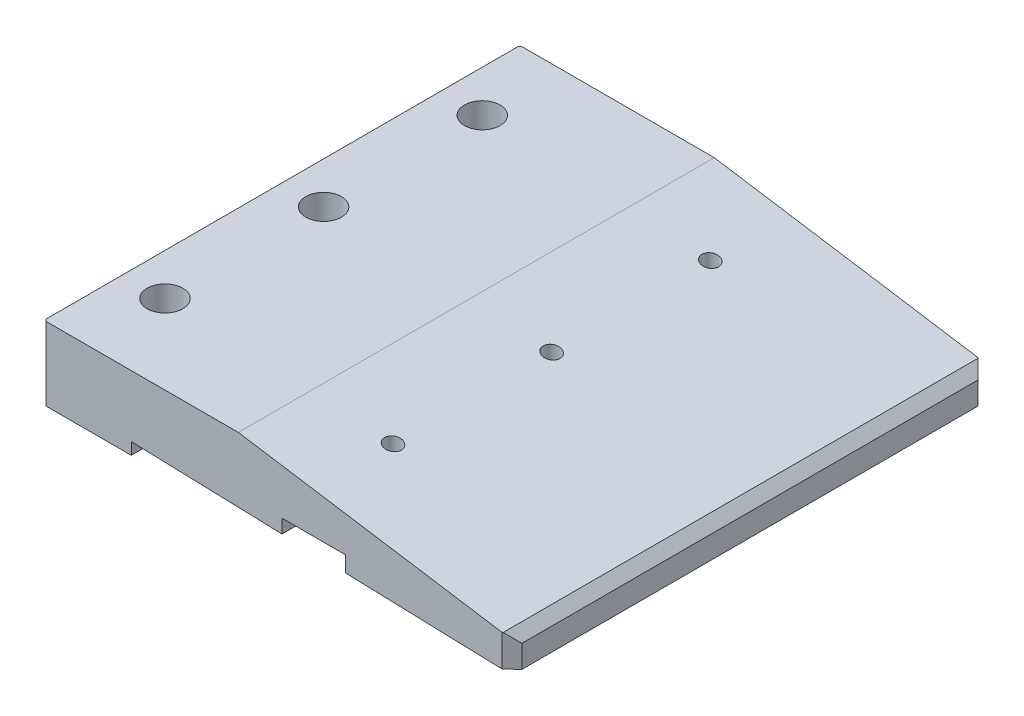
ISO-10303-21;
HEADER;
FILE_DESCRIPTION(('STEP AP214'),'2;1');
FILE_NAME('part.step','',(''),(''),'','','');
FILE_SCHEMA(('AUTOMOTIVE_DESIGN { 1 0 10303 214 1 1 1 1 }'));
ENDSEC;
DATA;
#1=APPLICATION_CONTEXT('core data for automotive mechanical design processes');
#2=APPLICATION_PROTOCOL_DEFINITION('international standard','automotive_design',2000,#1);
#3=PRODUCT_CONTEXT('',#1,'mechanical');
#4=PRODUCT('Part','Part','',(#3));
#5=PRODUCT_RELATED_PRODUCT_CATEGORY('part','',(#4));
#6=PRODUCT_DEFINITION_FORMATION('','',#4);
#7=PRODUCT_DEFINITION_CONTEXT('part definition',#1,'design');
#8=PRODUCT_DEFINITION('design','',#6,#7);
#9=PRODUCT_DEFINITION_SHAPE('','',#8);
#10=(LENGTH_UNIT() NAMED_UNIT(*) SI_UNIT(.MILLI.,.METRE.));
#11=(NAMED_UNIT(*) PLANE_ANGLE_UNIT() SI_UNIT($,.RADIAN.));
#12=(NAMED_UNIT(*) SI_UNIT($,.STERADIAN.) SOLID_ANGLE_UNIT());
#13=UNCERTAINTY_MEASURE_WITH_UNIT(LENGTH_MEASURE(1.E-05),#10,'distance_accuracy_value','');
#14=(GEOMETRIC_REPRESENTATION_CONTEXT(3) GLOBAL_UNCERTAINTY_ASSIGNED_CONTEXT((#13)) GLOBAL_UNIT_ASSIGNED_CONTEXT((#10,
#11,#12)) REPRESENTATION_CONTEXT('',''));
#15=CARTESIAN_POINT('',(0.,0.,0.));
#16=DIRECTION('',(0.,0.,1.));
#17=DIRECTION('',(1.,0.,0.));
#18=AXIS2_PLACEMENT_3D('',#15,#16,#17);
#19=CARTESIAN_POINT('',(0.,-18.5,120.));
#20=DIRECTION('',(1.,0.,0.));
#21=DIRECTION('',(0.,0.,-1.));
#22=AXIS2_PLACEMENT_3D('',#19,#20,#21);
#23=PLANE('',#22);
#24=DIRECTION('',(0.,1.,0.));
#25=VECTOR('',#24,1.);
#26=CARTESIAN_POINT('',(0.,-18.5,117.5));
#27=LINE('',#26,#25);
#28=CARTESIAN_POINT('',(0.,-18.5,117.5));
#29=VERTEX_POINT('',#28);
#30=CARTESIAN_POINT('',(0.,-2.,117.5));
#31=VERTEX_POINT('',#30);
#32=EDGE_CURVE('E234',#29,#31,#27,.T.);
#33=ORIENTED_EDGE('',*,*,#32,.T.);
#34=DIRECTION('',(0.,0.,-1.));
#35=VECTOR('',#34,1.);
#36=CARTESIAN_POINT('',(0.,-2.,120.));
#37=LINE('',#36,#35);
#38=CARTESIAN_POINT('',(0.,-2.,2.5));
#39=VERTEX_POINT('',#38);
#40=EDGE_CURVE('E278',#31,#39,#37,.T.);
#41=ORIENTED_EDGE('',*,*,#40,.T.);
#42=DIRECTION('',(0.,-1.,0.));
#43=VECTOR('',#42,1.);
#44=CARTESIAN_POINT('',(0.,-18.5,2.5));
#45=LINE('',#44,#43);
#46=CARTESIAN_POINT('',(0.,-18.5,2.5));
#47=VERTEX_POINT('',#46);
#48=EDGE_CURVE('E237',#39,#47,#45,.T.);
#49=ORIENTED_EDGE('',*,*,#48,.T.);
#50=DIRECTION('',(0.,0.,-1.));
#51=VECTOR('',#50,1.);
#52=CARTESIAN_POINT('',(0.,-18.5,120.));
#53=LINE('',#52,#51);
#54=EDGE_CURVE('E172',#29,#47,#53,.T.);
#55=ORIENTED_EDGE('',*,*,#54,.F.);
#56=EDGE_LOOP('',(#33,#41,#49,#55));
#57=FACE_BOUND('',#56,.T.);
#58=ADVANCED_FACE('F33',(#57),#23,.F.);
#59=CARTESIAN_POINT('',(24.,-18.5,120.));
#60=DIRECTION('',(0.,1.,0.));
#61=DIRECTION('',(-1.,0.,0.));
#62=AXIS2_PLACEMENT_3D('',#59,#60,#61);
#63=PLANE('',#62);
#64=CARTESIAN_POINT('',(12.5,-18.5,20.));
#65=DIRECTION('',(0.,-1.,0.));
#66=DIRECTION('',(0.,0.,-1.));
#67=AXIS2_PLACEMENT_3D('',#64,#65,#66);
#68=CIRCLE('',#67,7.50000000000001);
#69=CARTESIAN_POINT('',(12.5,-18.5,12.5));
#70=VERTEX_POINT('',#69);
#71=EDGE_CURVE('E646',#70,#70,#68,.T.);
#72=ORIENTED_EDGE('',*,*,#71,.F.);
#73=EDGE_LOOP('',(#72));
#74=FACE_BOUND('',#73,.T.);
#75=CARTESIAN_POINT('',(12.5,-18.5,60.));
#76=DIRECTION('',(0.,-1.,0.));
#77=DIRECTION('',(0.,0.,-1.));
#78=AXIS2_PLACEMENT_3D('',#75,#76,#77);
#79=CIRCLE('',#78,7.50000000000001);
#80=CARTESIAN_POINT('',(12.5,-18.5,52.5));
#81=VERTEX_POINT('',#80);
#82=EDGE_CURVE('E634',#81,#81,#79,.T.);
#83=ORIENTED_EDGE('',*,*,#82,.F.);
#84=EDGE_LOOP('',(#83));
#85=FACE_BOUND('',#84,.T.);
#86=CARTESIAN_POINT('',(12.5,-18.5,100.));
#87=DIRECTION('',(0.,-1.,0.));
#88=DIRECTION('',(0.,0.,-1.));
#89=AXIS2_PLACEMENT_3D('',#86,#87,#88);
#90=CIRCLE('',#89,7.50000000000001);
#91=CARTESIAN_POINT('',(12.5,-18.5,92.5));
#92=VERTEX_POINT('',#91);
#93=EDGE_CURVE('E620',#92,#92,#90,.T.);
#94=ORIENTED_EDGE('',*,*,#93,.F.);
#95=EDGE_LOOP('',(#94));
#96=FACE_BOUND('',#95,.T.);
#97=ORIENTED_EDGE('',*,*,#54,.T.);
#98=DIRECTION('',(0.707106781186548,0.,-0.707106781186548));
#99=VECTOR('',#98,1.);
#100=CARTESIAN_POINT('',(0.,-18.5,2.5));
#101=LINE('',#100,#99);
#102=CARTESIAN_POINT('',(2.5,-18.5,0.));
#103=VERTEX_POINT('',#102);
#104=EDGE_CURVE('E241',#47,#103,#101,.T.);
#105=ORIENTED_EDGE('',*,*,#104,.T.);
#106=DIRECTION('',(1.,0.,0.));
#107=VECTOR('',#106,1.);
#108=CARTESIAN_POINT('',(24.,-18.5,0.));
#109=LINE('',#108,#107);
#110=CARTESIAN_POINT('',(24.,-18.5,0.));
#111=VERTEX_POINT('',#110);
#112=EDGE_CURVE('E169',#103,#111,#109,.T.);
#113=ORIENTED_EDGE('',*,*,#112,.T.);
#114=DIRECTION('',(0.,0.,-1.));
#115=VECTOR('',#114,1.);
#116=CARTESIAN_POINT('',(24.,-18.5,120.));
#117=LINE('',#116,#115);
#118=CARTESIAN_POINT('',(24.,-18.5,120.));
#119=VERTEX_POINT('',#118);
#120=EDGE_CURVE('E165',#119,#111,#117,.T.);
#121=ORIENTED_EDGE('',*,*,#120,.F.);
#122=DIRECTION('',(1.,0.,0.));
#123=VECTOR('',#122,1.);
#124=CARTESIAN_POINT('',(24.,-18.5,120.));
#125=LINE('',#124,#123);
#126=CARTESIAN_POINT('',(2.5,-18.5,120.));
#127=VERTEX_POINT('',#126);
#128=EDGE_CURVE('E151',#127,#119,#125,.T.);
#129=ORIENTED_EDGE('',*,*,#128,.F.);
#130=DIRECTION('',(0.707106781186546,0.,0.707106781186549));
#131=VECTOR('',#130,1.);
#132=CARTESIAN_POINT('',(2.5,-18.5,120.));
#133=LINE('',#132,#131);
#134=EDGE_CURVE('E239',#127,#29,#133,.F.);
#135=ORIENTED_EDGE('',*,*,#134,.T.);
#136=EDGE_LOOP('',(#97,#105,#113,#121,#129,#135));
#137=FACE_BOUND('',#136,.T.);
#138=ADVANCED_FACE('F167',(#74,#85,#96,#137),#63,.F.);
#139=CARTESIAN_POINT('',(24.,-15.5,120.));
#140=DIRECTION('',(-1.,0.,0.));
#141=DIRECTION('',(0.,0.,1.));
#142=AXIS2_PLACEMENT_3D('',#139,#140,#141);
#143=PLANE('',#142);
#144=DIRECTION('',(0.,1.,0.));
#145=VECTOR('',#144,1.);
#146=CARTESIAN_POINT('',(24.,-15.5,0.));
#147=LINE('',#146,#145);
#148=CARTESIAN_POINT('',(24.,-15.5,0.));
#149=VERTEX_POINT('',#148);
#150=EDGE_CURVE('E197',#111,#149,#147,.T.);
#151=ORIENTED_EDGE('',*,*,#150,.T.);
#152=DIRECTION('',(0.,0.,-1.));
#153=VECTOR('',#152,1.);
#154=CARTESIAN_POINT('',(24.,-15.5,120.));
#155=LINE('',#154,#153);
#156=CARTESIAN_POINT('',(24.,-15.5,120.));
#157=VERTEX_POINT('',#156);
#158=EDGE_CURVE('E173',#157,#149,#155,.T.);
#159=ORIENTED_EDGE('',*,*,#158,.F.);
#160=DIRECTION('',(0.,1.,0.));
#161=VECTOR('',#160,1.);
#162=CARTESIAN_POINT('',(24.,-15.5,120.));
#163=LINE('',#162,#161);
#164=EDGE_CURVE('E156',#119,#157,#163,.T.);
#165=ORIENTED_EDGE('',*,*,#164,.F.);
#166=ORIENTED_EDGE('',*,*,#120,.T.);
#167=EDGE_LOOP('',(#151,#159,#165,#166));
#168=FACE_BOUND('',#167,.T.);
#169=ADVANCED_FACE('F175',(#168),#143,.F.);
#170=CARTESIAN_POINT('',(62.,-16.6875,120.));
#171=DIRECTION('',(0.0312347523777212,0.999512076087079,0.));
#172=DIRECTION('',(-0.999512076087079,0.0312347523777212,0.));
#173=AXIS2_PLACEMENT_3D('',#170,#171,#172);
#174=PLANE('',#173);
#175=DIRECTION('',(0.999512076087079,-0.0312347523777212,0.));
#176=VECTOR('',#175,1.);
#177=CARTESIAN_POINT('',(62.,-16.6875,0.));
#178=LINE('',#177,#176);
#179=CARTESIAN_POINT('',(62.,-16.6875,0.));
#180=VERTEX_POINT('',#179);
#181=EDGE_CURVE('E200',#149,#180,#178,.T.);
#182=ORIENTED_EDGE('',*,*,#181,.T.);
#183=DIRECTION('',(0.,0.,-1.));
#184=VECTOR('',#183,1.);
#185=CARTESIAN_POINT('',(62.,-16.6875,120.));
#186=LINE('',#185,#184);
#187=CARTESIAN_POINT('',(62.,-16.6875,120.));
#188=VERTEX_POINT('',#187);
#189=EDGE_CURVE('E229',#188,#180,#186,.T.);
#190=ORIENTED_EDGE('',*,*,#189,.F.);
#191=DIRECTION('',(0.999512076087079,-0.0312347523777212,0.));
#192=VECTOR('',#191,1.);
#193=CARTESIAN_POINT('',(62.,-16.6875,120.));
#194=LINE('',#193,#192);
#195=EDGE_CURVE('E178',#157,#188,#194,.T.);
#196=ORIENTED_EDGE('',*,*,#195,.F.);
#197=ORIENTED_EDGE('',*,*,#158,.T.);
#198=EDGE_LOOP('',(#182,#190,#196,#197));
#199=FACE_BOUND('',#198,.T.);
#200=ADVANCED_FACE('F561',(#199),#174,.F.);
#201=CARTESIAN_POINT('',(62.,-13.2175,120.));
#202=DIRECTION('',(-1.,0.,0.));
#203=DIRECTION('',(0.,0.,1.));
#204=AXIS2_PLACEMENT_3D('',#201,#202,#203);
#205=PLANE('',#204);
#206=DIRECTION('',(0.,1.,0.));
#207=VECTOR('',#206,1.);
#208=CARTESIAN_POINT('',(62.,-13.2175,0.));
#209=LINE('',#208,#207);
#210=CARTESIAN_POINT('',(62.,-13.2175,0.));
#211=VERTEX_POINT('',#210);
#212=EDGE_CURVE('E202',#180,#211,#209,.T.);
#213=ORIENTED_EDGE('',*,*,#212,.T.);
#214=DIRECTION('',(0.,0.,-1.));
#215=VECTOR('',#214,1.);
#216=CARTESIAN_POINT('',(62.,-13.2175,120.));
#217=LINE('',#216,#215);
#218=CARTESIAN_POINT('',(62.,-13.2175,120.));
#219=VERTEX_POINT('',#218);
#220=EDGE_CURVE('E226',#219,#211,#217,.T.);
#221=ORIENTED_EDGE('',*,*,#220,.F.);
#222=DIRECTION('',(0.,1.,0.));
#223=VECTOR('',#222,1.);
#224=CARTESIAN_POINT('',(62.,-13.2175,120.));
#225=LINE('',#224,#223);
#226=EDGE_CURVE('E180',#188,#219,#225,.T.);
#227=ORIENTED_EDGE('',*,*,#226,.F.);
#228=ORIENTED_EDGE('',*,*,#189,.T.);
#229=EDGE_LOOP('',(#213,#221,#227,#228));
#230=FACE_BOUND('',#229,.T.);
#231=ADVANCED_FACE('F460',(#230),#205,.F.);
#232=CARTESIAN_POINT('',(78.,-13.2175,120.));
#233=DIRECTION('',(0.,1.,0.));
#234=DIRECTION('',(-1.,0.,0.));
#235=AXIS2_PLACEMENT_3D('',#232,#233,#234);
#236=PLANE('',#235);
#237=CARTESIAN_POINT('',(70.,-13.2175,100.));
#238=DIRECTION('',(0.,-1.,0.));
#239=DIRECTION('',(1.,0.,0.));
#240=AXIS2_PLACEMENT_3D('',#237,#238,#239);
#241=CIRCLE('',#240,2.1);
#242=CARTESIAN_POINT('',(72.1,-13.2175,100.));
#243=VERTEX_POINT('',#242);
#244=EDGE_CURVE('E660',#243,#243,#241,.T.);
#245=ORIENTED_EDGE('',*,*,#244,.F.);
#246=EDGE_LOOP('',(#245));
#247=FACE_BOUND('',#246,.T.);
#248=CARTESIAN_POINT('',(70.,-13.2175,60.));
#249=DIRECTION('',(0.,-1.,0.));
#250=DIRECTION('',(1.,0.,0.));
#251=AXIS2_PLACEMENT_3D('',#248,#249,#250);
#252=CIRCLE('',#251,2.1);
#253=CARTESIAN_POINT('',(72.1,-13.2175,60.));
#254=VERTEX_POINT('',#253);
#255=EDGE_CURVE('E653',#254,#254,#252,.T.);
#256=ORIENTED_EDGE('',*,*,#255,.F.);
#257=EDGE_LOOP('',(#256));
#258=FACE_BOUND('',#257,.T.);
#259=CARTESIAN_POINT('',(70.,-13.2175,20.));
#260=DIRECTION('',(0.,-1.,0.));
#261=DIRECTION('',(1.,0.,0.));
#262=AXIS2_PLACEMENT_3D('',#259,#260,#261);
#263=CIRCLE('',#262,2.1);
#264=CARTESIAN_POINT('',(72.1,-13.2175,20.));
#265=VERTEX_POINT('',#264);
#266=EDGE_CURVE('E654',#265,#265,#263,.T.);
#267=ORIENTED_EDGE('',*,*,#266,.F.);
#268=EDGE_LOOP('',(#267));
#269=FACE_BOUND('',#268,.T.);
#270=DIRECTION('',(1.,0.,0.));
#271=VECTOR('',#270,1.);
#272=CARTESIAN_POINT('',(78.,-13.2175,0.));
#273=LINE('',#272,#271);
#274=CARTESIAN_POINT('',(78.,-13.2175,0.));
#275=VERTEX_POINT('',#274);
#276=EDGE_CURVE('E204',#211,#275,#273,.T.);
#277=ORIENTED_EDGE('',*,*,#276,.T.);
#278=DIRECTION('',(0.,0.,-1.));
#279=VECTOR('',#278,1.);
#280=CARTESIAN_POINT('',(78.,-13.2175,120.));
#281=LINE('',#280,#279);
#282=CARTESIAN_POINT('',(78.,-13.2175,120.));
#283=VERTEX_POINT('',#282);
#284=EDGE_CURVE('E223',#283,#275,#281,.T.);
#285=ORIENTED_EDGE('',*,*,#284,.F.);
#286=DIRECTION('',(1.,0.,0.));
#287=VECTOR('',#286,1.);
#288=CARTESIAN_POINT('',(78.,-13.2175,120.));
#289=LINE('',#288,#287);
#290=EDGE_CURVE('E185',#219,#283,#289,.T.);
#291=ORIENTED_EDGE('',*,*,#290,.F.);
#292=ORIENTED_EDGE('',*,*,#220,.T.);
#293=EDGE_LOOP('',(#277,#285,#291,#292));
#294=FACE_BOUND('',#293,.T.);
#295=ADVANCED_FACE('F455',(#247,#258,#269,#294),#236,.F.);
#296=CARTESIAN_POINT('',(78.,-17.1875,120.));
#297=DIRECTION('',(1.,0.,0.));
#298=DIRECTION('',(0.,1.,0.));
#299=AXIS2_PLACEMENT_3D('',#296,#297,#298);
#300=PLANE('',#299);
#301=DIRECTION('',(0.,-1.,0.));
#302=VECTOR('',#301,1.);
#303=CARTESIAN_POINT('',(78.,-17.1875,0.));
#304=LINE('',#303,#302);
#305=CARTESIAN_POINT('',(78.,-17.1875,0.));
#306=VERTEX_POINT('',#305);
#307=EDGE_CURVE('E206',#275,#306,#304,.T.);
#308=ORIENTED_EDGE('',*,*,#307,.T.);
#309=DIRECTION('',(0.,0.,-1.));
#310=VECTOR('',#309,1.);
#311=CARTESIAN_POINT('',(78.,-17.1875,120.));
#312=LINE('',#311,#310);
#313=CARTESIAN_POINT('',(78.,-17.1875,120.));
#314=VERTEX_POINT('',#313);
#315=EDGE_CURVE('E220',#314,#306,#312,.T.);
#316=ORIENTED_EDGE('',*,*,#315,.F.);
#317=DIRECTION('',(0.,-1.,0.));
#318=VECTOR('',#317,1.);
#319=CARTESIAN_POINT('',(78.,-17.1875,120.));
#320=LINE('',#319,#318);
#321=EDGE_CURVE('E187',#283,#314,#320,.T.);
#322=ORIENTED_EDGE('',*,*,#321,.F.);
#323=ORIENTED_EDGE('',*,*,#284,.T.);
#324=EDGE_LOOP('',(#308,#316,#322,#323));
#325=FACE_BOUND('',#324,.T.);
#326=ADVANCED_FACE('F413',(#325),#300,.F.);
#327=CARTESIAN_POINT('',(120.,-18.5,120.));
#328=DIRECTION('',(0.0312347523777211,0.999512076087079,0.));
#329=DIRECTION('',(-0.999512076087079,0.0312347523777211,0.));
#330=AXIS2_PLACEMENT_3D('',#327,#328,#329);
#331=PLANE('',#330);
#332=DIRECTION('',(0.999512076087079,-0.0312347523777211,0.));
#333=VECTOR('',#332,1.);
#334=CARTESIAN_POINT('',(120.,-18.5,0.));
#335=LINE('',#334,#333);
#336=CARTESIAN_POINT('',(117.5,-18.421875,0.));
#337=VERTEX_POINT('',#336);
#338=EDGE_CURVE('E208',#306,#337,#335,.T.);
#339=ORIENTED_EDGE('',*,*,#338,.T.);
#340=DIRECTION('',(0.706934210889608,-0.0220916940903002,0.706934210889604));
#341=VECTOR('',#340,1.);
#342=CARTESIAN_POINT('',(119.879746217667,-18.4962420693021,2.37974621766716));
#343=LINE('',#342,#341);
#344=CARTESIAN_POINT('',(120.,-18.5,2.5));
#345=VERTEX_POINT('',#344);
#346=EDGE_CURVE('E263',#337,#345,#343,.T.);
#347=ORIENTED_EDGE('',*,*,#346,.T.);
#348=DIRECTION('',(0.,0.,-1.));
#349=VECTOR('',#348,1.);
#350=CARTESIAN_POINT('',(120.,-18.5,120.));
#351=LINE('',#350,#349);
#352=CARTESIAN_POINT('',(120.,-18.5,117.5));
#353=VERTEX_POINT('',#352);
#354=EDGE_CURVE('E217',#353,#345,#351,.T.);
#355=ORIENTED_EDGE('',*,*,#354,.F.);
#356=DIRECTION('',(0.706934210889606,-0.0220916940903001,-0.706934210889606));
#357=VECTOR('',#356,1.);
#358=CARTESIAN_POINT('',(117.212298682284,-18.4128843338214,120.287701317716));
#359=LINE('',#358,#357);
#360=CARTESIAN_POINT('',(117.5,-18.421875,120.));
#361=VERTEX_POINT('',#360);
#362=EDGE_CURVE('E261',#353,#361,#359,.F.);
#363=ORIENTED_EDGE('',*,*,#362,.T.);
#364=DIRECTION('',(0.999512076087079,-0.0312347523777211,0.));
#365=VECTOR('',#364,1.);
#366=CARTESIAN_POINT('',(120.,-18.5,120.));
#367=LINE('',#366,#365);
#368=EDGE_CURVE('E189',#314,#361,#367,.T.);
#369=ORIENTED_EDGE('',*,*,#368,.F.);
#370=ORIENTED_EDGE('',*,*,#315,.T.);
#371=EDGE_LOOP('',(#339,#347,#355,#363,#369,#370));
#372=FACE_BOUND('',#371,.T.);
#373=ADVANCED_FACE('F384',(#372),#331,.F.);
#374=CARTESIAN_POINT('',(120.,-10.8,120.));
#375=DIRECTION('',(-1.,0.,0.));
#376=DIRECTION('',(0.,0.,1.));
#377=AXIS2_PLACEMENT_3D('',#374,#375,#376);
#378=PLANE('',#377);
#379=DIRECTION('',(0.,1.,0.));
#380=VECTOR('',#379,1.);
#381=CARTESIAN_POINT('',(120.,-10.8,2.5));
#382=LINE('',#381,#380);
#383=CARTESIAN_POINT('',(120.,-12.8,2.5));
#384=VERTEX_POINT('',#383);
#385=EDGE_CURVE('E253',#345,#384,#382,.T.);
#386=ORIENTED_EDGE('',*,*,#385,.T.);
#387=DIRECTION('',(0.,0.,1.));
#388=VECTOR('',#387,1.);
#389=CARTESIAN_POINT('',(120.,-12.8,120.));
#390=LINE('',#389,#388);
#391=CARTESIAN_POINT('',(120.,-12.8,117.5));
#392=VERTEX_POINT('',#391);
#393=EDGE_CURVE('E274',#384,#392,#390,.T.);
#394=ORIENTED_EDGE('',*,*,#393,.T.);
#395=DIRECTION('',(0.,-1.,0.));
#396=VECTOR('',#395,1.);
#397=CARTESIAN_POINT('',(120.,-10.8,117.5));
#398=LINE('',#397,#396);
#399=EDGE_CURVE('E251',#392,#353,#398,.T.);
#400=ORIENTED_EDGE('',*,*,#399,.T.);
#401=ORIENTED_EDGE('',*,*,#354,.T.);
#402=EDGE_LOOP('',(#386,#394,#400,#401));
#403=FACE_BOUND('',#402,.T.);
#404=ADVANCED_FACE('F374',(#403),#378,.F.);
#405=CARTESIAN_POINT('',(51.,0.,120.));
#406=DIRECTION('',(-0.154638946991012,-0.987971050220355,0.));
#407=DIRECTION('',(0.987971050220355,-0.154638946991012,0.));
#408=AXIS2_PLACEMENT_3D('',#405,#406,#407);
#409=PLANE('',#408);
#410=CARTESIAN_POINT('',(70.,-2.97391304347826,100.));
#411=DIRECTION('',(-0.154638946991012,-0.987971050220355,0.));
#412=DIRECTION('',(0.987971050220355,-0.154638946991012,0.));
#413=AXIS2_PLACEMENT_3D('',#410,#411,#412);
#414=ELLIPSE('',#413,2.12556835499545,2.1);
#415=CARTESIAN_POINT('',(72.1,-3.30260869565217,100.));
#416=VERTEX_POINT('',#415);
#417=EDGE_CURVE('E649',#416,#416,#414,.F.);
#418=ORIENTED_EDGE('',*,*,#417,.F.);
#419=EDGE_LOOP('',(#418));
#420=FACE_BOUND('',#419,.T.);
#421=CARTESIAN_POINT('',(70.,-2.97391304347826,60.));
#422=DIRECTION('',(-0.154638946991012,-0.987971050220355,0.));
#423=DIRECTION('',(0.987971050220355,-0.154638946991012,0.));
#424=AXIS2_PLACEMENT_3D('',#421,#422,#423);
#425=ELLIPSE('',#424,2.12556835499545,2.1);
#426=CARTESIAN_POINT('',(72.1,-3.30260869565217,60.));
#427=VERTEX_POINT('',#426);
#428=EDGE_CURVE('E657',#427,#427,#425,.F.);
#429=ORIENTED_EDGE('',*,*,#428,.F.);
#430=EDGE_LOOP('',(#429));
#431=FACE_BOUND('',#430,.T.);
#432=CARTESIAN_POINT('',(70.,-2.97391304347826,20.));
#433=DIRECTION('',(-0.154638946991012,-0.987971050220355,0.));
#434=DIRECTION('',(0.987971050220355,-0.154638946991012,0.));
#435=AXIS2_PLACEMENT_3D('',#432,#433,#434);
#436=ELLIPSE('',#435,2.12556835499545,2.1);
#437=CARTESIAN_POINT('',(72.1,-3.30260869565217,20.));
#438=VERTEX_POINT('',#437);
#439=EDGE_CURVE('E650',#438,#438,#436,.F.);
#440=ORIENTED_EDGE('',*,*,#439,.F.);
#441=EDGE_LOOP('',(#440));
#442=FACE_BOUND('',#441,.T.);
#443=DIRECTION('',(-0.702815305646335,0.110005873927252,0.702815305646335));
#444=VECTOR('',#443,1.);
#445=CARTESIAN_POINT('',(116.69526406215,-10.2827369836408,120.80473593785));
#446=LINE('',#445,#444);
#447=CARTESIAN_POINT('',(117.5,-10.4086956521739,120.));
#448=VERTEX_POINT('',#447);
#449=CARTESIAN_POINT('',(117.628865979381,-10.4288659793814,119.871134020619));
#450=VERTEX_POINT('',#449);
#451=EDGE_CURVE('E256',#448,#450,#446,.F.);
#452=ORIENTED_EDGE('',*,*,#451,.T.);
#453=DIRECTION('',(0.,0.,-1.));
#454=VECTOR('',#453,1.);
#455=CARTESIAN_POINT('',(117.628865979381,-10.4288659793814,120.));
#456=LINE('',#455,#454);
#457=CARTESIAN_POINT('',(117.628865979381,-10.4288659793814,0.128865979381457));
#458=VERTEX_POINT('',#457);
#459=EDGE_CURVE('E269',#450,#458,#456,.T.);
#460=ORIENTED_EDGE('',*,*,#459,.T.);
#461=DIRECTION('',(-0.702815305646337,0.110005873927253,-0.702815305646333));
#462=VECTOR('',#461,1.);
#463=CARTESIAN_POINT('',(120.,-10.8,2.5));
#464=LINE('',#463,#462);
#465=CARTESIAN_POINT('',(117.5,-10.4086956521739,0.));
#466=VERTEX_POINT('',#465);
#467=EDGE_CURVE('E259',#458,#466,#464,.T.);
#468=ORIENTED_EDGE('',*,*,#467,.T.);
#469=DIRECTION('',(-0.987971050220355,0.154638946991012,0.));
#470=VECTOR('',#469,1.);
#471=CARTESIAN_POINT('',(51.,0.,0.));
#472=LINE('',#471,#470);
#473=CARTESIAN_POINT('',(51.,0.,0.));
#474=VERTEX_POINT('',#473);
#475=EDGE_CURVE('E211',#466,#474,#472,.T.);
#476=ORIENTED_EDGE('',*,*,#475,.T.);
#477=DIRECTION('',(0.,0.,-1.));
#478=VECTOR('',#477,1.);
#479=CARTESIAN_POINT('',(51.,0.,120.));
#480=LINE('',#479,#478);
#481=CARTESIAN_POINT('',(51.,0.,120.));
#482=VERTEX_POINT('',#481);
#483=EDGE_CURVE('E195',#482,#474,#480,.T.);
#484=ORIENTED_EDGE('',*,*,#483,.F.);
#485=DIRECTION('',(-0.987971050220355,0.154638946991012,0.));
#486=VECTOR('',#485,1.);
#487=CARTESIAN_POINT('',(51.,0.,120.));
#488=LINE('',#487,#486);
#489=EDGE_CURVE('E191',#448,#482,#488,.T.);
#490=ORIENTED_EDGE('',*,*,#489,.F.);
#491=EDGE_LOOP('',(#452,#460,#468,#476,#484,#490));
#492=FACE_BOUND('',#491,.T.);
#493=ADVANCED_FACE('F346',(#420,#431,#442,#492),#409,.F.);
#494=CARTESIAN_POINT('',(0.,0.,120.));
#495=DIRECTION('',(0.,-1.,0.));
#496=DIRECTION('',(0.,0.,-1.));
#497=AXIS2_PLACEMENT_3D('',#494,#495,#496);
#498=PLANE('',#497);
#499=CARTESIAN_POINT('',(12.5,0.,20.));
#500=DIRECTION('',(0.,-1.,0.));
#501=DIRECTION('',(0.,0.,-1.));
#502=AXIS2_PLACEMENT_3D('',#499,#500,#501);
#503=CIRCLE('',#502,4.50000000000001);
#504=CARTESIAN_POINT('',(12.5,0.,15.5));
#505=VERTEX_POINT('',#504);
#506=EDGE_CURVE('E637',#505,#505,#503,.T.);
#507=ORIENTED_EDGE('',*,*,#506,.T.);
#508=EDGE_LOOP('',(#507));
#509=FACE_BOUND('',#508,.T.);
#510=CARTESIAN_POINT('',(12.5,0.,60.));
#511=DIRECTION('',(0.,-1.,0.));
#512=DIRECTION('',(0.,0.,-1.));
#513=AXIS2_PLACEMENT_3D('',#510,#511,#512);
#514=CIRCLE('',#513,4.50000000000001);
#515=CARTESIAN_POINT('',(12.5,0.,55.5));
#516=VERTEX_POINT('',#515);
#517=EDGE_CURVE('E625',#516,#516,#514,.T.);
#518=ORIENTED_EDGE('',*,*,#517,.T.);
#519=EDGE_LOOP('',(#518));
#520=FACE_BOUND('',#519,.T.);
#521=CARTESIAN_POINT('',(12.5,0.,100.));
#522=DIRECTION('',(0.,-1.,0.));
#523=DIRECTION('',(0.,0.,-1.));
#524=AXIS2_PLACEMENT_3D('',#521,#522,#523);
#525=CIRCLE('',#524,4.50000000000001);
#526=CARTESIAN_POINT('',(12.5,0.,95.5));
#527=VERTEX_POINT('',#526);
#528=EDGE_CURVE('E198',#527,#527,#525,.T.);
#529=ORIENTED_EDGE('',*,*,#528,.T.);
#530=EDGE_LOOP('',(#529));
#531=FACE_BOUND('',#530,.T.);
#532=DIRECTION('',(-0.707106781186548,0.,0.707106781186548));
#533=VECTOR('',#532,1.);
#534=CARTESIAN_POINT('',(0.,0.,2.5));
#535=LINE('',#534,#533);
#536=CARTESIAN_POINT('',(2.5,0.,0.));
#537=VERTEX_POINT('',#536);
#538=CARTESIAN_POINT('',(2.,0.,0.5));
#539=VERTEX_POINT('',#538);
#540=EDGE_CURVE('E249',#537,#539,#535,.T.);
#541=ORIENTED_EDGE('',*,*,#540,.T.);
#542=DIRECTION('',(0.,0.,1.));
#543=VECTOR('',#542,1.);
#544=CARTESIAN_POINT('',(2.,0.,120.));
#545=LINE('',#544,#543);
#546=CARTESIAN_POINT('',(2.,0.,119.5));
#547=VERTEX_POINT('',#546);
#548=EDGE_CURVE('E41',#539,#547,#545,.T.);
#549=ORIENTED_EDGE('',*,*,#548,.T.);
#550=DIRECTION('',(-0.707106781186546,0.,-0.707106781186549));
#551=VECTOR('',#550,1.);
#552=CARTESIAN_POINT('',(2.5,0.,120.));
#553=LINE('',#552,#551);
#554=CARTESIAN_POINT('',(2.5,0.,120.));
#555=VERTEX_POINT('',#554);
#556=EDGE_CURVE('E247',#547,#555,#553,.F.);
#557=ORIENTED_EDGE('',*,*,#556,.T.);
#558=DIRECTION('',(-1.,0.,0.));
#559=VECTOR('',#558,1.);
#560=CARTESIAN_POINT('',(0.,0.,120.));
#561=LINE('',#560,#559);
#562=EDGE_CURVE('E193',#482,#555,#561,.T.);
#563=ORIENTED_EDGE('',*,*,#562,.F.);
#564=ORIENTED_EDGE('',*,*,#483,.T.);
#565=DIRECTION('',(-1.,0.,0.));
#566=VECTOR('',#565,1.);
#567=CARTESIAN_POINT('',(0.,0.,0.));
#568=LINE('',#567,#566);
#569=EDGE_CURVE('E162',#474,#537,#568,.T.);
#570=ORIENTED_EDGE('',*,*,#569,.T.);
#571=EDGE_LOOP('',(#541,#549,#557,#563,#564,#570));
#572=FACE_BOUND('',#571,.T.);
#573=ADVANCED_FACE('F342',(#509,#520,#531,#572),#498,.F.);
#574=CARTESIAN_POINT('',(0.,0.,120.));
#575=DIRECTION('',(0.,0.,-1.));
#576=DIRECTION('',(-1.,0.,0.));
#577=AXIS2_PLACEMENT_3D('',#574,#575,#576);
#578=PLANE('',#577);
#579=ORIENTED_EDGE('',*,*,#368,.T.);
#580=DIRECTION('',(0.,1.,0.));
#581=VECTOR('',#580,1.);
#582=CARTESIAN_POINT('',(117.5,0.,120.));
#583=LINE('',#582,#581);
#584=EDGE_CURVE('E266',#361,#448,#583,.T.);
#585=ORIENTED_EDGE('',*,*,#584,.T.);
#586=ORIENTED_EDGE('',*,*,#489,.T.);
#587=ORIENTED_EDGE('',*,*,#562,.T.);
#588=DIRECTION('',(0.,-1.,0.));
#589=VECTOR('',#588,1.);
#590=CARTESIAN_POINT('',(2.5,0.,120.));
#591=LINE('',#590,#589);
#592=EDGE_CURVE('E160',#555,#127,#591,.T.);
#593=ORIENTED_EDGE('',*,*,#592,.T.);
#594=ORIENTED_EDGE('',*,*,#128,.T.);
#595=ORIENTED_EDGE('',*,*,#164,.T.);
#596=ORIENTED_EDGE('',*,*,#195,.T.);
#597=ORIENTED_EDGE('',*,*,#226,.T.);
#598=ORIENTED_EDGE('',*,*,#290,.T.);
#599=ORIENTED_EDGE('',*,*,#321,.T.);
#600=EDGE_LOOP('',(#579,#585,#586,#587,#593,#594,#595,#596,#597,#598,#599));
#601=FACE_BOUND('',#600,.T.);
#602=ADVANCED_FACE('F154',(#601),#578,.F.);
#603=CARTESIAN_POINT('',(0.,0.,0.));
#604=DIRECTION('',(0.,0.,-1.));
#605=DIRECTION('',(-1.,0.,0.));
#606=AXIS2_PLACEMENT_3D('',#603,#604,#605);
#607=PLANE('',#606);
#608=ORIENTED_EDGE('',*,*,#112,.F.);
#609=DIRECTION('',(0.,1.,0.));
#610=VECTOR('',#609,1.);
#611=CARTESIAN_POINT('',(2.5,0.,0.));
#612=LINE('',#611,#610);
#613=EDGE_CURVE('E245',#103,#537,#612,.T.);
#614=ORIENTED_EDGE('',*,*,#613,.T.);
#615=ORIENTED_EDGE('',*,*,#569,.F.);
#616=ORIENTED_EDGE('',*,*,#475,.F.);
#617=DIRECTION('',(0.,-1.,0.));
#618=VECTOR('',#617,1.);
#619=CARTESIAN_POINT('',(117.5,-18.5,0.));
#620=LINE('',#619,#618);
#621=EDGE_CURVE('E243',#466,#337,#620,.T.);
#622=ORIENTED_EDGE('',*,*,#621,.T.);
#623=ORIENTED_EDGE('',*,*,#338,.F.);
#624=ORIENTED_EDGE('',*,*,#307,.F.);
#625=ORIENTED_EDGE('',*,*,#276,.F.);
#626=ORIENTED_EDGE('',*,*,#212,.F.);
#627=ORIENTED_EDGE('',*,*,#181,.F.);
#628=ORIENTED_EDGE('',*,*,#150,.F.);
#629=EDGE_LOOP('',(#608,#614,#615,#616,#622,#623,#624,#625,#626,#627,#628));
#630=FACE_BOUND('',#629,.T.);
#631=ADVANCED_FACE('F392',(#630),#607,.T.);
#632=CARTESIAN_POINT('',(12.5,-18.5,100.));
#633=DIRECTION('',(0.,-1.,0.));
#634=DIRECTION('',(0.,0.,-1.));
#635=AXIS2_PLACEMENT_3D('',#632,#633,#634);
#636=CYLINDRICAL_SURFACE('',#635,4.50000000000001);
#637=ORIENTED_EDGE('',*,*,#528,.F.);
#638=EDGE_LOOP('',(#637));
#639=FACE_BOUND('',#638,.T.);
#640=CARTESIAN_POINT('',(12.5,-9.5,100.));
#641=DIRECTION('',(0.,-1.,0.));
#642=DIRECTION('',(0.,0.,-1.));
#643=AXIS2_PLACEMENT_3D('',#640,#641,#642);
#644=CIRCLE('',#643,4.50000000000001);
#645=CARTESIAN_POINT('',(12.5,-9.5,95.5));
#646=VERTEX_POINT('',#645);
#647=EDGE_CURVE('E616',#646,#646,#644,.T.);
#648=ORIENTED_EDGE('',*,*,#647,.T.);
#649=EDGE_LOOP('',(#648));
#650=FACE_BOUND('',#649,.T.);
#651=ADVANCED_FACE('F397',(#639,#650),#636,.F.);
#652=CARTESIAN_POINT('',(17.,-9.5,100.));
#653=DIRECTION('',(0.,1.,0.));
#654=DIRECTION('',(0.,0.,1.));
#655=AXIS2_PLACEMENT_3D('',#652,#653,#654);
#656=PLANE('',#655);
#657=ORIENTED_EDGE('',*,*,#647,.F.);
#658=EDGE_LOOP('',(#657));
#659=FACE_BOUND('',#658,.T.);
#660=CARTESIAN_POINT('',(12.5,-9.5,100.));
#661=DIRECTION('',(0.,-1.,0.));
#662=DIRECTION('',(0.,0.,-1.));
#663=AXIS2_PLACEMENT_3D('',#660,#661,#662);
#664=CIRCLE('',#663,7.50000000000001);
#665=CARTESIAN_POINT('',(12.5,-9.5,92.5));
#666=VERTEX_POINT('',#665);
#667=EDGE_CURVE('E617',#666,#666,#664,.T.);
#668=ORIENTED_EDGE('',*,*,#667,.T.);
#669=EDGE_LOOP('',(#668));
#670=FACE_BOUND('',#669,.T.);
#671=ADVANCED_FACE('F530',(#659,#670),#656,.F.);
#672=CARTESIAN_POINT('',(12.5,-18.5,100.));
#673=DIRECTION('',(0.,-1.,0.));
#674=DIRECTION('',(0.,0.,-1.));
#675=AXIS2_PLACEMENT_3D('',#672,#673,#674);
#676=CYLINDRICAL_SURFACE('',#675,7.50000000000001);
#677=ORIENTED_EDGE('',*,*,#667,.F.);
#678=EDGE_LOOP('',(#677));
#679=FACE_BOUND('',#678,.T.);
#680=ORIENTED_EDGE('',*,*,#93,.T.);
#681=EDGE_LOOP('',(#680));
#682=FACE_BOUND('',#681,.T.);
#683=ADVANCED_FACE('F520',(#679,#682),#676,.F.);
#684=CARTESIAN_POINT('',(12.5,-18.5,60.));
#685=DIRECTION('',(0.,-1.,0.));
#686=DIRECTION('',(0.,0.,-1.));
#687=AXIS2_PLACEMENT_3D('',#684,#685,#686);
#688=CYLINDRICAL_SURFACE('',#687,4.50000000000001);
#689=ORIENTED_EDGE('',*,*,#517,.F.);
#690=EDGE_LOOP('',(#689));
#691=FACE_BOUND('',#690,.T.);
#692=CARTESIAN_POINT('',(12.5,-9.5,60.));
#693=DIRECTION('',(0.,-1.,0.));
#694=DIRECTION('',(0.,0.,-1.));
#695=AXIS2_PLACEMENT_3D('',#692,#693,#694);
#696=CIRCLE('',#695,4.50000000000001);
#697=CARTESIAN_POINT('',(12.5,-9.5,55.5));
#698=VERTEX_POINT('',#697);
#699=EDGE_CURVE('E628',#698,#698,#696,.T.);
#700=ORIENTED_EDGE('',*,*,#699,.T.);
#701=EDGE_LOOP('',(#700));
#702=FACE_BOUND('',#701,.T.);
#703=ADVANCED_FACE('F510',(#691,#702),#688,.F.);
#704=CARTESIAN_POINT('',(17.,-9.5,60.));
#705=DIRECTION('',(0.,1.,0.));
#706=DIRECTION('',(0.,0.,1.));
#707=AXIS2_PLACEMENT_3D('',#704,#705,#706);
#708=PLANE('',#707);
#709=ORIENTED_EDGE('',*,*,#699,.F.);
#710=EDGE_LOOP('',(#709));
#711=FACE_BOUND('',#710,.T.);
#712=CARTESIAN_POINT('',(12.5,-9.5,60.));
#713=DIRECTION('',(0.,-1.,0.));
#714=DIRECTION('',(0.,0.,-1.));
#715=AXIS2_PLACEMENT_3D('',#712,#713,#714);
#716=CIRCLE('',#715,7.50000000000001);
#717=CARTESIAN_POINT('',(12.5,-9.5,52.5));
#718=VERTEX_POINT('',#717);
#719=EDGE_CURVE('E631',#718,#718,#716,.T.);
#720=ORIENTED_EDGE('',*,*,#719,.T.);
#721=EDGE_LOOP('',(#720));
#722=FACE_BOUND('',#721,.T.);
#723=ADVANCED_FACE('F500',(#711,#722),#708,.F.);
#724=CARTESIAN_POINT('',(12.5,-18.5,60.));
#725=DIRECTION('',(0.,-1.,0.));
#726=DIRECTION('',(0.,0.,-1.));
#727=AXIS2_PLACEMENT_3D('',#724,#725,#726);
#728=CYLINDRICAL_SURFACE('',#727,7.50000000000001);
#729=ORIENTED_EDGE('',*,*,#719,.F.);
#730=EDGE_LOOP('',(#729));
#731=FACE_BOUND('',#730,.T.);
#732=ORIENTED_EDGE('',*,*,#82,.T.);
#733=EDGE_LOOP('',(#732));
#734=FACE_BOUND('',#733,.T.);
#735=ADVANCED_FACE('F490',(#731,#734),#728,.F.);
#736=CARTESIAN_POINT('',(12.5,-18.5,20.));
#737=DIRECTION('',(0.,-1.,0.));
#738=DIRECTION('',(0.,0.,-1.));
#739=AXIS2_PLACEMENT_3D('',#736,#737,#738);
#740=CYLINDRICAL_SURFACE('',#739,4.50000000000001);
#741=ORIENTED_EDGE('',*,*,#506,.F.);
#742=EDGE_LOOP('',(#741));
#743=FACE_BOUND('',#742,.T.);
#744=CARTESIAN_POINT('',(12.5,-9.5,20.));
#745=DIRECTION('',(0.,-1.,0.));
#746=DIRECTION('',(0.,0.,-1.));
#747=AXIS2_PLACEMENT_3D('',#744,#745,#746);
#748=CIRCLE('',#747,4.50000000000001);
#749=CARTESIAN_POINT('',(12.5,-9.5,15.5));
#750=VERTEX_POINT('',#749);
#751=EDGE_CURVE('E640',#750,#750,#748,.T.);
#752=ORIENTED_EDGE('',*,*,#751,.T.);
#753=EDGE_LOOP('',(#752));
#754=FACE_BOUND('',#753,.T.);
#755=ADVANCED_FACE('F480',(#743,#754),#740,.F.);
#756=CARTESIAN_POINT('',(17.,-9.5,20.));
#757=DIRECTION('',(0.,1.,0.));
#758=DIRECTION('',(0.,0.,1.));
#759=AXIS2_PLACEMENT_3D('',#756,#757,#758);
#760=PLANE('',#759);
#761=ORIENTED_EDGE('',*,*,#751,.F.);
#762=EDGE_LOOP('',(#761));
#763=FACE_BOUND('',#762,.T.);
#764=CARTESIAN_POINT('',(12.5,-9.5,20.));
#765=DIRECTION('',(0.,-1.,0.));
#766=DIRECTION('',(0.,0.,-1.));
#767=AXIS2_PLACEMENT_3D('',#764,#765,#766);
#768=CIRCLE('',#767,7.50000000000001);
#769=CARTESIAN_POINT('',(12.5,-9.5,12.5));
#770=VERTEX_POINT('',#769);
#771=EDGE_CURVE('E643',#770,#770,#768,.T.);
#772=ORIENTED_EDGE('',*,*,#771,.T.);
#773=EDGE_LOOP('',(#772));
#774=FACE_BOUND('',#773,.T.);
#775=ADVANCED_FACE('F470',(#763,#774),#760,.F.);
#776=CARTESIAN_POINT('',(12.5,-18.5,20.));
#777=DIRECTION('',(0.,-1.,0.));
#778=DIRECTION('',(0.,0.,-1.));
#779=AXIS2_PLACEMENT_3D('',#776,#777,#778);
#780=CYLINDRICAL_SURFACE('',#779,7.50000000000001);
#781=ORIENTED_EDGE('',*,*,#771,.F.);
#782=EDGE_LOOP('',(#781));
#783=FACE_BOUND('',#782,.T.);
#784=ORIENTED_EDGE('',*,*,#71,.T.);
#785=EDGE_LOOP('',(#784));
#786=FACE_BOUND('',#785,.T.);
#787=ADVANCED_FACE('F447',(#783,#786),#780,.F.);
#788=CARTESIAN_POINT('',(70.,0.00100000000002182,20.));
#789=DIRECTION('',(0.,-1.,0.));
#790=DIRECTION('',(1.,0.,0.));
#791=AXIS2_PLACEMENT_3D('',#788,#789,#790);
#792=CYLINDRICAL_SURFACE('',#791,2.1);
#793=ORIENTED_EDGE('',*,*,#266,.T.);
#794=EDGE_LOOP('',(#793));
#795=FACE_BOUND('',#794,.T.);
#796=ORIENTED_EDGE('',*,*,#439,.T.);
#797=EDGE_LOOP('',(#796));
#798=FACE_BOUND('',#797,.T.);
#799=ADVANCED_FACE('F437',(#795,#798),#792,.F.);
#800=CARTESIAN_POINT('',(70.,0.00100000000002182,60.));
#801=DIRECTION('',(0.,-1.,0.));
#802=DIRECTION('',(1.,0.,0.));
#803=AXIS2_PLACEMENT_3D('',#800,#801,#802);
#804=CYLINDRICAL_SURFACE('',#803,2.1);
#805=ORIENTED_EDGE('',*,*,#255,.T.);
#806=EDGE_LOOP('',(#805));
#807=FACE_BOUND('',#806,.T.);
#808=ORIENTED_EDGE('',*,*,#428,.T.);
#809=EDGE_LOOP('',(#808));
#810=FACE_BOUND('',#809,.T.);
#811=ADVANCED_FACE('F429',(#807,#810),#804,.F.);
#812=CARTESIAN_POINT('',(70.,0.00100000000002182,100.));
#813=DIRECTION('',(0.,-1.,0.));
#814=DIRECTION('',(1.,0.,0.));
#815=AXIS2_PLACEMENT_3D('',#812,#813,#814);
#816=CYLINDRICAL_SURFACE('',#815,2.1);
#817=ORIENTED_EDGE('',*,*,#244,.T.);
#818=EDGE_LOOP('',(#817));
#819=FACE_BOUND('',#818,.T.);
#820=ORIENTED_EDGE('',*,*,#417,.T.);
#821=EDGE_LOOP('',(#820));
#822=FACE_BOUND('',#821,.T.);
#823=ADVANCED_FACE('F310',(#819,#822),#816,.F.);
#824=CARTESIAN_POINT('',(0.,-18.5,2.5));
#825=DIRECTION('',(-0.707106781186547,0.,-0.707106781186547));
#826=DIRECTION('',(0.,1.,0.));
#827=AXIS2_PLACEMENT_3D('',#824,#825,#826);
#828=PLANE('',#827);
#829=ORIENTED_EDGE('',*,*,#48,.F.);
#830=DIRECTION('',(-0.577350269189626,-0.577350269189626,0.577350269189626));
#831=VECTOR('',#830,1.);
#832=CARTESIAN_POINT('',(-5.5,-7.5,8.));
#833=LINE('',#832,#831);
#834=EDGE_CURVE('E55',#39,#539,#833,.F.);
#835=ORIENTED_EDGE('',*,*,#834,.T.);
#836=ORIENTED_EDGE('',*,*,#540,.F.);
#837=ORIENTED_EDGE('',*,*,#613,.F.);
#838=ORIENTED_EDGE('',*,*,#104,.F.);
#839=EDGE_LOOP('',(#829,#835,#836,#837,#838));
#840=FACE_BOUND('',#839,.T.);
#841=ADVANCED_FACE('F288',(#840),#828,.T.);
#842=CARTESIAN_POINT('',(120.,-10.8,2.5));
#843=DIRECTION('',(0.707106781186545,0.,-0.707106781186549));
#844=DIRECTION('',(0.,-1.,0.));
#845=AXIS2_PLACEMENT_3D('',#842,#843,#844);
#846=PLANE('',#845);
#847=ORIENTED_EDGE('',*,*,#467,.F.);
#848=DIRECTION('',(-0.577350269189627,0.577350269189627,-0.577350269189624));
#849=VECTOR('',#848,1.);
#850=CARTESIAN_POINT('',(119.333333333333,-12.1333333333333,1.83333333333334));
#851=LINE('',#850,#849);
#852=EDGE_CURVE('E272',#458,#384,#851,.F.);
#853=ORIENTED_EDGE('',*,*,#852,.T.);
#854=ORIENTED_EDGE('',*,*,#385,.F.);
#855=ORIENTED_EDGE('',*,*,#346,.F.);
#856=ORIENTED_EDGE('',*,*,#621,.F.);
#857=EDGE_LOOP('',(#847,#853,#854,#855,#856));
#858=FACE_BOUND('',#857,.T.);
#859=ADVANCED_FACE('F309',(#858),#846,.T.);
#860=CARTESIAN_POINT('',(117.5,0.,120.));
#861=DIRECTION('',(-0.707106781186547,0.,-0.707106781186547));
#862=DIRECTION('',(0.,1.,0.));
#863=AXIS2_PLACEMENT_3D('',#860,#861,#862);
#864=PLANE('',#863);
#865=ORIENTED_EDGE('',*,*,#399,.F.);
#866=DIRECTION('',(-0.577350269189626,0.577350269189625,0.577350269189626));
#867=VECTOR('',#866,1.);
#868=CARTESIAN_POINT('',(114.066666666667,-6.86666666666664,123.433333333333));
#869=LINE('',#868,#867);
#870=EDGE_CURVE('E276',#392,#450,#869,.T.);
#871=ORIENTED_EDGE('',*,*,#870,.T.);
#872=ORIENTED_EDGE('',*,*,#451,.F.);
#873=ORIENTED_EDGE('',*,*,#584,.F.);
#874=ORIENTED_EDGE('',*,*,#362,.F.);
#875=EDGE_LOOP('',(#865,#871,#872,#873,#874));
#876=FACE_BOUND('',#875,.T.);
#877=ADVANCED_FACE('F313',(#876),#864,.F.);
#878=CARTESIAN_POINT('',(2.5,0.,120.));
#879=DIRECTION('',(0.707106781186549,0.,-0.707106781186545));
#880=DIRECTION('',(0.,-1.,0.));
#881=AXIS2_PLACEMENT_3D('',#878,#879,#880);
#882=PLANE('',#881);
#883=ORIENTED_EDGE('',*,*,#556,.F.);
#884=DIRECTION('',(-0.577350269189625,-0.577350269189625,-0.577350269189628));
#885=VECTOR('',#884,1.);
#886=CARTESIAN_POINT('',(2.33333333333334,0.333333333333334,119.833333333333));
#887=LINE('',#886,#885);
#888=EDGE_CURVE('E11',#547,#31,#887,.T.);
#889=ORIENTED_EDGE('',*,*,#888,.T.);
#890=ORIENTED_EDGE('',*,*,#32,.F.);
#891=ORIENTED_EDGE('',*,*,#134,.F.);
#892=ORIENTED_EDGE('',*,*,#592,.F.);
#893=EDGE_LOOP('',(#883,#889,#890,#891,#892));
#894=FACE_BOUND('',#893,.T.);
#895=ADVANCED_FACE('F291',(#894),#882,.F.);
#896=CARTESIAN_POINT('',(117.628865979381,-10.4288659793814,120.));
#897=DIRECTION('',(-0.707106781186547,-0.707106781186548,0.));
#898=DIRECTION('',(0.,0.,-1.));
#899=AXIS2_PLACEMENT_3D('',#896,#897,#898);
#900=PLANE('',#899);
#901=ORIENTED_EDGE('',*,*,#870,.F.);
#902=ORIENTED_EDGE('',*,*,#393,.F.);
#903=ORIENTED_EDGE('',*,*,#852,.F.);
#904=ORIENTED_EDGE('',*,*,#459,.F.);
#905=EDGE_LOOP('',(#901,#902,#903,#904));
#906=FACE_BOUND('',#905,.T.);
#907=ADVANCED_FACE('F293',(#906),#900,.F.);
#908=CARTESIAN_POINT('',(0.,-2.,120.));
#909=DIRECTION('',(0.707106781186547,-0.707106781186547,0.));
#910=DIRECTION('',(0.,0.,-1.));
#911=AXIS2_PLACEMENT_3D('',#908,#909,#910);
#912=PLANE('',#911);
#913=ORIENTED_EDGE('',*,*,#888,.F.);
#914=ORIENTED_EDGE('',*,*,#548,.F.);
#915=ORIENTED_EDGE('',*,*,#834,.F.);
#916=ORIENTED_EDGE('',*,*,#40,.F.);
#917=EDGE_LOOP('',(#913,#914,#915,#916));
#918=FACE_BOUND('',#917,.T.);
#919=ADVANCED_FACE('F35',(#918),#912,.F.);
#920=CLOSED_SHELL('',(#58,#138,#169,#200,#231,#295,#326,#373,#404,#493,#573,#602,#631,#651,#671,
#683,#703,#723,#735,#755,#775,#787,#799,#811,#823,#841,#859,#877,#895,#907,#919));
#921=MANIFOLD_SOLID_BREP('B2',#920);
#922=ADVANCED_BREP_SHAPE_REPRESENTATION('',(#18,#921),#14);
#923=SHAPE_DEFINITION_REPRESENTATION(#9,#922);
ENDSEC;
END-ISO-10303-21;
